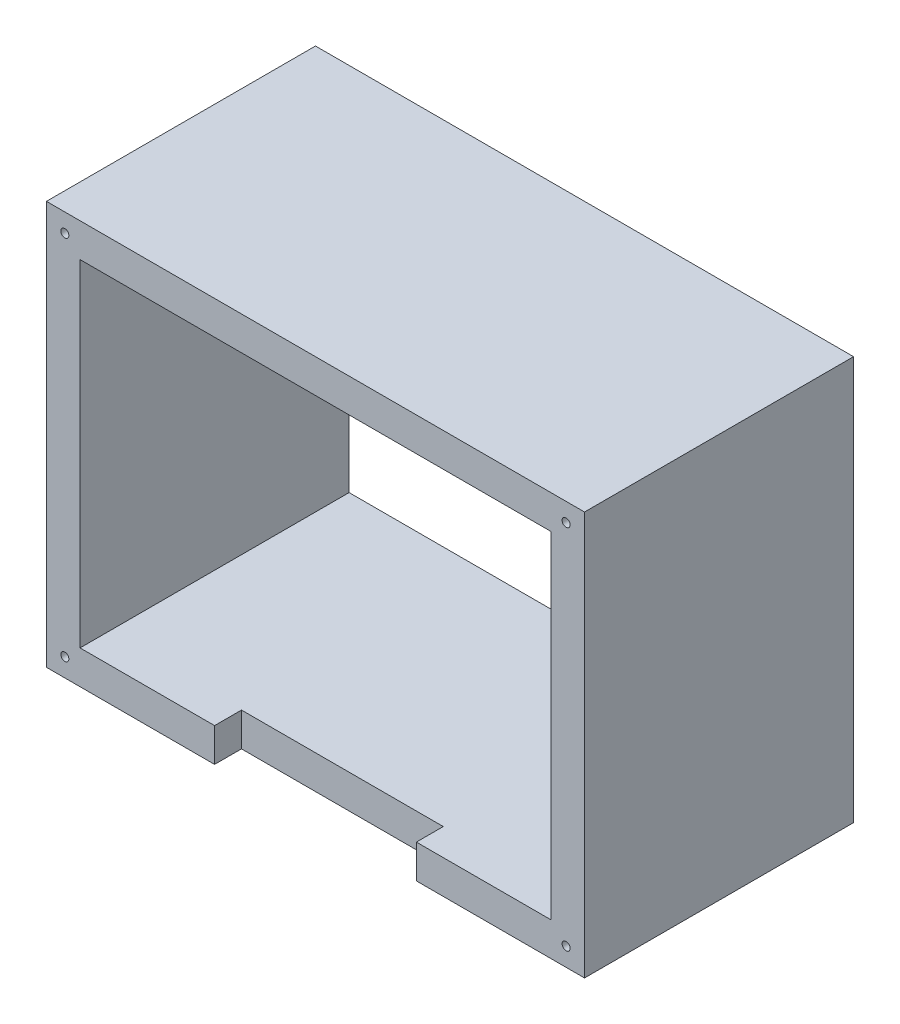
ISO-10303-21;
HEADER;
FILE_DESCRIPTION(('STEP AP214'),'2;1');
FILE_NAME('part.step','',(''),(''),'','','');
FILE_SCHEMA(('AUTOMOTIVE_DESIGN { 1 0 10303 214 1 1 1 1 }'));
ENDSEC;
DATA;
#1=APPLICATION_CONTEXT('core data for automotive mechanical design processes');
#2=APPLICATION_PROTOCOL_DEFINITION('international standard','automotive_design',2000,#1);
#3=PRODUCT_CONTEXT('',#1,'mechanical');
#4=PRODUCT('Part','Part','',(#3));
#5=PRODUCT_RELATED_PRODUCT_CATEGORY('part','',(#4));
#6=PRODUCT_DEFINITION_FORMATION('','',#4);
#7=PRODUCT_DEFINITION_CONTEXT('part definition',#1,'design');
#8=PRODUCT_DEFINITION('design','',#6,#7);
#9=PRODUCT_DEFINITION_SHAPE('','',#8);
#10=(LENGTH_UNIT() NAMED_UNIT(*) SI_UNIT(.MILLI.,.METRE.));
#11=(NAMED_UNIT(*) PLANE_ANGLE_UNIT() SI_UNIT($,.RADIAN.));
#12=(NAMED_UNIT(*) SI_UNIT($,.STERADIAN.) SOLID_ANGLE_UNIT());
#13=UNCERTAINTY_MEASURE_WITH_UNIT(LENGTH_MEASURE(1.E-05),#10,'distance_accuracy_value','');
#14=(GEOMETRIC_REPRESENTATION_CONTEXT(3) GLOBAL_UNCERTAINTY_ASSIGNED_CONTEXT((#13)) GLOBAL_UNIT_ASSIGNED_CONTEXT((#10,
#11,#12)) REPRESENTATION_CONTEXT('',''));
#15=CARTESIAN_POINT('',(0.,0.,0.));
#16=DIRECTION('',(0.,0.,1.));
#17=DIRECTION('',(1.,0.,0.));
#18=AXIS2_PLACEMENT_3D('',#15,#16,#17);
#19=CARTESIAN_POINT('',(-88.8348714569122,57.3807057270259,100.));
#20=DIRECTION('',(1.,0.,0.));
#21=DIRECTION('',(0.,1.,0.));
#22=AXIS2_PLACEMENT_3D('',#19,#20,#21);
#23=PLANE('',#22);
#24=DIRECTION('',(0.,-1.,0.));
#25=VECTOR('',#24,1.);
#26=CARTESIAN_POINT('',(-88.8348714569122,57.3807057270259,0.));
#27=LINE('',#26,#25);
#28=CARTESIAN_POINT('',(-88.8348714569122,57.3807057270259,0.));
#29=VERTEX_POINT('',#28);
#30=CARTESIAN_POINT('',(-88.8348714569122,-92.619294272974,0.));
#31=VERTEX_POINT('',#30);
#32=EDGE_CURVE('E179',#29,#31,#27,.T.);
#33=ORIENTED_EDGE('',*,*,#32,.T.);
#34=DIRECTION('',(0.,0.,-1.));
#35=VECTOR('',#34,1.);
#36=CARTESIAN_POINT('',(-88.8348714569122,-92.619294272974,100.));
#37=LINE('',#36,#35);
#38=CARTESIAN_POINT('',(-88.8348714569122,-92.619294272974,100.));
#39=VERTEX_POINT('',#38);
#40=EDGE_CURVE('E11',#39,#31,#37,.T.);
#41=ORIENTED_EDGE('',*,*,#40,.F.);
#42=DIRECTION('',(0.,-1.,0.));
#43=VECTOR('',#42,1.);
#44=CARTESIAN_POINT('',(-88.8348714569122,57.3807057270259,100.));
#45=LINE('',#44,#43);
#46=CARTESIAN_POINT('',(-88.8348714569122,57.3807057270259,100.));
#47=VERTEX_POINT('',#46);
#48=EDGE_CURVE('E186',#47,#39,#45,.T.);
#49=ORIENTED_EDGE('',*,*,#48,.F.);
#50=DIRECTION('',(0.,0.,-1.));
#51=VECTOR('',#50,1.);
#52=CARTESIAN_POINT('',(-88.8348714569122,57.3807057270259,100.));
#53=LINE('',#52,#51);
#54=EDGE_CURVE('E198',#47,#29,#53,.T.);
#55=ORIENTED_EDGE('',*,*,#54,.T.);
#56=EDGE_LOOP('',(#33,#41,#49,#55));
#57=FACE_BOUND('',#56,.T.);
#58=ADVANCED_FACE('F32',(#57),#23,.F.);
#59=CARTESIAN_POINT('',(-88.8348714569122,-92.619294272974,100.));
#60=DIRECTION('',(0.,1.,0.));
#61=DIRECTION('',(0.,0.,1.));
#62=AXIS2_PLACEMENT_3D('',#59,#60,#61);
#63=PLANE('',#62);
#64=DIRECTION('',(1.,0.,0.));
#65=VECTOR('',#64,1.);
#66=CARTESIAN_POINT('',(-88.8348714569122,-92.619294272974,100.));
#67=LINE('',#66,#65);
#68=CARTESIAN_POINT('',(48.6651285430878,-92.619294272974,100.));
#69=VERTEX_POINT('',#68);
#70=CARTESIAN_POINT('',(111.165128543088,-92.619294272974,100.));
#71=VERTEX_POINT('',#70);
#72=EDGE_CURVE('E189',#69,#71,#67,.T.);
#73=ORIENTED_EDGE('',*,*,#72,.F.);
#74=DIRECTION('',(0.,0.,-1.));
#75=VECTOR('',#74,1.);
#76=CARTESIAN_POINT('',(48.6651285430878,-92.619294272974,100.));
#77=LINE('',#76,#75);
#78=CARTESIAN_POINT('',(48.6651285430878,-92.619294272974,90.));
#79=VERTEX_POINT('',#78);
#80=EDGE_CURVE('E151',#69,#79,#77,.T.);
#81=ORIENTED_EDGE('',*,*,#80,.T.);
#82=DIRECTION('',(-1.,0.,0.));
#83=VECTOR('',#82,1.);
#84=CARTESIAN_POINT('',(-88.8348714569122,-92.619294272974,90.));
#85=LINE('',#84,#83);
#86=CARTESIAN_POINT('',(-26.3348714569122,-92.619294272974,90.));
#87=VERTEX_POINT('',#86);
#88=EDGE_CURVE('E147',#79,#87,#85,.T.);
#89=ORIENTED_EDGE('',*,*,#88,.T.);
#90=DIRECTION('',(0.,0.,1.));
#91=VECTOR('',#90,1.);
#92=CARTESIAN_POINT('',(-26.3348714569122,-92.619294272974,100.));
#93=LINE('',#92,#91);
#94=CARTESIAN_POINT('',(-26.3348714569122,-92.619294272974,100.));
#95=VERTEX_POINT('',#94);
#96=EDGE_CURVE('E128',#87,#95,#93,.T.);
#97=ORIENTED_EDGE('',*,*,#96,.T.);
#98=EDGE_CURVE('E191',#39,#95,#67,.T.);
#99=ORIENTED_EDGE('',*,*,#98,.F.);
#100=ORIENTED_EDGE('',*,*,#40,.T.);
#101=DIRECTION('',(1.,0.,0.));
#102=VECTOR('',#101,1.);
#103=CARTESIAN_POINT('',(-88.8348714569122,-92.619294272974,0.));
#104=LINE('',#103,#102);
#105=CARTESIAN_POINT('',(111.165128543088,-92.619294272974,0.));
#106=VERTEX_POINT('',#105);
#107=EDGE_CURVE('E201',#31,#106,#104,.T.);
#108=ORIENTED_EDGE('',*,*,#107,.T.);
#109=DIRECTION('',(0.,0.,-1.));
#110=VECTOR('',#109,1.);
#111=CARTESIAN_POINT('',(111.165128543088,-92.619294272974,100.));
#112=LINE('',#111,#110);
#113=EDGE_CURVE('E39',#71,#106,#112,.T.);
#114=ORIENTED_EDGE('',*,*,#113,.F.);
#115=EDGE_LOOP('',(#73,#81,#89,#97,#99,#100,#108,#114));
#116=FACE_BOUND('',#115,.T.);
#117=ADVANCED_FACE('F232',(#116),#63,.F.);
#118=CARTESIAN_POINT('',(111.165128543088,57.3807057270259,100.));
#119=DIRECTION('',(-1.,0.,0.));
#120=DIRECTION('',(0.,0.,1.));
#121=AXIS2_PLACEMENT_3D('',#118,#119,#120);
#122=PLANE('',#121);
#123=DIRECTION('',(0.,1.,0.));
#124=VECTOR('',#123,1.);
#125=CARTESIAN_POINT('',(111.165128543088,57.3807057270259,0.));
#126=LINE('',#125,#124);
#127=CARTESIAN_POINT('',(111.165128543088,57.3807057270259,0.));
#128=VERTEX_POINT('',#127);
#129=EDGE_CURVE('E203',#106,#128,#126,.T.);
#130=ORIENTED_EDGE('',*,*,#129,.T.);
#131=DIRECTION('',(0.,0.,-1.));
#132=VECTOR('',#131,1.);
#133=CARTESIAN_POINT('',(111.165128543088,57.3807057270259,100.));
#134=LINE('',#133,#132);
#135=CARTESIAN_POINT('',(111.165128543088,57.3807057270259,100.));
#136=VERTEX_POINT('',#135);
#137=EDGE_CURVE('E208',#136,#128,#134,.T.);
#138=ORIENTED_EDGE('',*,*,#137,.F.);
#139=DIRECTION('',(0.,1.,0.));
#140=VECTOR('',#139,1.);
#141=CARTESIAN_POINT('',(111.165128543088,57.3807057270259,100.));
#142=LINE('',#141,#140);
#143=EDGE_CURVE('E194',#71,#136,#142,.T.);
#144=ORIENTED_EDGE('',*,*,#143,.F.);
#145=ORIENTED_EDGE('',*,*,#113,.T.);
#146=EDGE_LOOP('',(#130,#138,#144,#145));
#147=FACE_BOUND('',#146,.T.);
#148=ADVANCED_FACE('F215',(#147),#122,.F.);
#149=CARTESIAN_POINT('',(-88.8348714569122,57.3807057270259,100.));
#150=DIRECTION('',(0.,-1.,0.));
#151=DIRECTION('',(0.,0.,-1.));
#152=AXIS2_PLACEMENT_3D('',#149,#150,#151);
#153=PLANE('',#152);
#154=DIRECTION('',(-1.,0.,0.));
#155=VECTOR('',#154,1.);
#156=CARTESIAN_POINT('',(-88.8348714569122,57.3807057270259,0.));
#157=LINE('',#156,#155);
#158=EDGE_CURVE('E190',#128,#29,#157,.T.);
#159=ORIENTED_EDGE('',*,*,#158,.T.);
#160=ORIENTED_EDGE('',*,*,#54,.F.);
#161=DIRECTION('',(-1.,0.,0.));
#162=VECTOR('',#161,1.);
#163=CARTESIAN_POINT('',(-88.8348714569122,57.3807057270259,100.));
#164=LINE('',#163,#162);
#165=EDGE_CURVE('E196',#136,#47,#164,.T.);
#166=ORIENTED_EDGE('',*,*,#165,.F.);
#167=ORIENTED_EDGE('',*,*,#137,.T.);
#168=EDGE_LOOP('',(#159,#160,#166,#167));
#169=FACE_BOUND('',#168,.T.);
#170=ADVANCED_FACE('F225',(#169),#153,.F.);
#171=CARTESIAN_POINT('',(0.,0.,100.));
#172=DIRECTION('',(0.,0.,1.));
#173=DIRECTION('',(1.,0.,0.));
#174=AXIS2_PLACEMENT_3D('',#171,#172,#173);
#175=PLANE('',#174);
#176=CARTESIAN_POINT('',(-81.9917257064046,-85.7761485224664,100.));
#177=DIRECTION('',(0.,0.,1.));
#178=DIRECTION('',(1.,0.,0.));
#179=AXIS2_PLACEMENT_3D('',#176,#177,#178);
#180=CIRCLE('',#179,1.5);
#181=CARTESIAN_POINT('',(-80.4917257064046,-85.7761485224664,100.));
#182=VERTEX_POINT('',#181);
#183=EDGE_CURVE('E334',#182,#182,#180,.T.);
#184=ORIENTED_EDGE('',*,*,#183,.F.);
#185=EDGE_LOOP('',(#184));
#186=FACE_BOUND('',#185,.T.);
#187=CARTESIAN_POINT('',(104.32198279258,50.5375599765183,100.));
#188=DIRECTION('',(0.,0.,1.));
#189=DIRECTION('',(1.,0.,0.));
#190=AXIS2_PLACEMENT_3D('',#187,#188,#189);
#191=CIRCLE('',#190,1.5);
#192=CARTESIAN_POINT('',(105.82198279258,50.5375599765183,100.));
#193=VERTEX_POINT('',#192);
#194=EDGE_CURVE('E321',#193,#193,#191,.T.);
#195=ORIENTED_EDGE('',*,*,#194,.F.);
#196=EDGE_LOOP('',(#195));
#197=FACE_BOUND('',#196,.T.);
#198=CARTESIAN_POINT('',(104.32198279258,-85.7761485224664,100.));
#199=DIRECTION('',(0.,0.,1.));
#200=DIRECTION('',(1.,0.,0.));
#201=AXIS2_PLACEMENT_3D('',#198,#199,#200);
#202=CIRCLE('',#201,1.5);
#203=CARTESIAN_POINT('',(105.82198279258,-85.7761485224664,100.));
#204=VERTEX_POINT('',#203);
#205=EDGE_CURVE('E322',#204,#204,#202,.T.);
#206=ORIENTED_EDGE('',*,*,#205,.F.);
#207=EDGE_LOOP('',(#206));
#208=FACE_BOUND('',#207,.T.);
#209=CARTESIAN_POINT('',(-81.9917257064046,50.5375599765183,100.));
#210=DIRECTION('',(0.,0.,1.));
#211=DIRECTION('',(1.,0.,0.));
#212=AXIS2_PLACEMENT_3D('',#209,#210,#211);
#213=CIRCLE('',#212,1.5);
#214=CARTESIAN_POINT('',(-80.4917257064046,50.5375599765183,100.));
#215=VERTEX_POINT('',#214);
#216=EDGE_CURVE('E333',#215,#215,#213,.T.);
#217=ORIENTED_EDGE('',*,*,#216,.F.);
#218=EDGE_LOOP('',(#217));
#219=FACE_BOUND('',#218,.T.);
#220=DIRECTION('',(0.,1.,0.));
#221=VECTOR('',#220,1.);
#222=CARTESIAN_POINT('',(48.6651285430878,-95.1192942729741,100.));
#223=LINE('',#222,#221);
#224=CARTESIAN_POINT('',(48.6651285430878,-80.1192942729741,100.));
#225=VERTEX_POINT('',#224);
#226=EDGE_CURVE('E145',#69,#225,#223,.T.);
#227=ORIENTED_EDGE('',*,*,#226,.F.);
#228=ORIENTED_EDGE('',*,*,#72,.T.);
#229=ORIENTED_EDGE('',*,*,#143,.T.);
#230=ORIENTED_EDGE('',*,*,#165,.T.);
#231=ORIENTED_EDGE('',*,*,#48,.T.);
#232=ORIENTED_EDGE('',*,*,#98,.T.);
#233=DIRECTION('',(0.,1.,0.));
#234=VECTOR('',#233,1.);
#235=CARTESIAN_POINT('',(-26.3348714569122,-95.1192942729741,100.));
#236=LINE('',#235,#234);
#237=CARTESIAN_POINT('',(-26.3348714569122,-80.1192942729741,100.));
#238=VERTEX_POINT('',#237);
#239=EDGE_CURVE('E131',#95,#238,#236,.T.);
#240=ORIENTED_EDGE('',*,*,#239,.T.);
#241=DIRECTION('',(-1.,0.,0.));
#242=VECTOR('',#241,1.);
#243=CARTESIAN_POINT('',(98.6651285430878,-80.1192942729741,100.));
#244=LINE('',#243,#242);
#245=CARTESIAN_POINT('',(-76.3348714569122,-80.1192942729741,100.));
#246=VERTEX_POINT('',#245);
#247=EDGE_CURVE('E54',#238,#246,#244,.T.);
#248=ORIENTED_EDGE('',*,*,#247,.T.);
#249=DIRECTION('',(0.,1.,0.));
#250=VECTOR('',#249,1.);
#251=CARTESIAN_POINT('',(-76.3348714569122,44.8807057270259,100.));
#252=LINE('',#251,#250);
#253=CARTESIAN_POINT('',(-76.3348714569122,44.8807057270259,100.));
#254=VERTEX_POINT('',#253);
#255=EDGE_CURVE('E162',#246,#254,#252,.T.);
#256=ORIENTED_EDGE('',*,*,#255,.T.);
#257=DIRECTION('',(1.,0.,0.));
#258=VECTOR('',#257,1.);
#259=CARTESIAN_POINT('',(98.6651285430878,44.8807057270259,100.));
#260=LINE('',#259,#258);
#261=CARTESIAN_POINT('',(98.6651285430878,44.8807057270259,100.));
#262=VERTEX_POINT('',#261);
#263=EDGE_CURVE('E164',#254,#262,#260,.T.);
#264=ORIENTED_EDGE('',*,*,#263,.T.);
#265=DIRECTION('',(0.,-1.,0.));
#266=VECTOR('',#265,1.);
#267=CARTESIAN_POINT('',(98.6651285430878,44.8807057270259,100.));
#268=LINE('',#267,#266);
#269=CARTESIAN_POINT('',(98.6651285430878,-80.1192942729741,100.));
#270=VERTEX_POINT('',#269);
#271=EDGE_CURVE('E155',#262,#270,#268,.T.);
#272=ORIENTED_EDGE('',*,*,#271,.T.);
#273=EDGE_CURVE('E159',#270,#225,#244,.T.);
#274=ORIENTED_EDGE('',*,*,#273,.T.);
#275=EDGE_LOOP('',(#227,#228,#229,#230,#231,#232,#240,#248,#256,#264,#272,#274));
#276=FACE_BOUND('',#275,.T.);
#277=ADVANCED_FACE('F231',(#186,#197,#208,#219,#276),#175,.T.);
#278=CARTESIAN_POINT('',(0.,0.,0.));
#279=DIRECTION('',(0.,0.,1.));
#280=DIRECTION('',(1.,0.,0.));
#281=AXIS2_PLACEMENT_3D('',#278,#279,#280);
#282=PLANE('',#281);
#283=DIRECTION('',(-1.,0.,0.));
#284=VECTOR('',#283,1.);
#285=CARTESIAN_POINT('',(98.6651285430878,-80.1192942729741,0.));
#286=LINE('',#285,#284);
#287=CARTESIAN_POINT('',(98.6651285430878,-80.1192942729741,0.));
#288=VERTEX_POINT('',#287);
#289=CARTESIAN_POINT('',(-76.3348714569122,-80.1192942729741,0.));
#290=VERTEX_POINT('',#289);
#291=EDGE_CURVE('E169',#288,#290,#286,.T.);
#292=ORIENTED_EDGE('',*,*,#291,.F.);
#293=DIRECTION('',(0.,-1.,0.));
#294=VECTOR('',#293,1.);
#295=CARTESIAN_POINT('',(98.6651285430878,44.8807057270259,0.));
#296=LINE('',#295,#294);
#297=CARTESIAN_POINT('',(98.6651285430878,44.8807057270259,0.));
#298=VERTEX_POINT('',#297);
#299=EDGE_CURVE('E154',#298,#288,#296,.T.);
#300=ORIENTED_EDGE('',*,*,#299,.F.);
#301=DIRECTION('',(1.,0.,0.));
#302=VECTOR('',#301,1.);
#303=CARTESIAN_POINT('',(98.6651285430878,44.8807057270259,0.));
#304=LINE('',#303,#302);
#305=CARTESIAN_POINT('',(-76.3348714569122,44.8807057270259,0.));
#306=VERTEX_POINT('',#305);
#307=EDGE_CURVE('E158',#306,#298,#304,.T.);
#308=ORIENTED_EDGE('',*,*,#307,.F.);
#309=DIRECTION('',(0.,1.,0.));
#310=VECTOR('',#309,1.);
#311=CARTESIAN_POINT('',(-76.3348714569122,44.8807057270259,0.));
#312=LINE('',#311,#310);
#313=EDGE_CURVE('E172',#290,#306,#312,.T.);
#314=ORIENTED_EDGE('',*,*,#313,.F.);
#315=EDGE_LOOP('',(#292,#300,#308,#314));
#316=FACE_BOUND('',#315,.T.);
#317=ORIENTED_EDGE('',*,*,#32,.F.);
#318=ORIENTED_EDGE('',*,*,#158,.F.);
#319=ORIENTED_EDGE('',*,*,#129,.F.);
#320=ORIENTED_EDGE('',*,*,#107,.F.);
#321=EDGE_LOOP('',(#317,#318,#319,#320));
#322=FACE_BOUND('',#321,.T.);
#323=ADVANCED_FACE('F222',(#316,#322),#282,.F.);
#324=CARTESIAN_POINT('',(98.6651285430878,44.8807057270259,100.));
#325=DIRECTION('',(1.,0.,0.));
#326=DIRECTION('',(0.,1.,0.));
#327=AXIS2_PLACEMENT_3D('',#324,#325,#326);
#328=PLANE('',#327);
#329=ORIENTED_EDGE('',*,*,#299,.T.);
#330=DIRECTION('',(0.,0.,-1.));
#331=VECTOR('',#330,1.);
#332=CARTESIAN_POINT('',(98.6651285430878,-80.1192942729741,100.));
#333=LINE('',#332,#331);
#334=EDGE_CURVE('E167',#270,#288,#333,.T.);
#335=ORIENTED_EDGE('',*,*,#334,.F.);
#336=ORIENTED_EDGE('',*,*,#271,.F.);
#337=DIRECTION('',(0.,0.,-1.));
#338=VECTOR('',#337,1.);
#339=CARTESIAN_POINT('',(98.6651285430878,44.8807057270259,100.));
#340=LINE('',#339,#338);
#341=EDGE_CURVE('E177',#262,#298,#340,.T.);
#342=ORIENTED_EDGE('',*,*,#341,.T.);
#343=EDGE_LOOP('',(#329,#335,#336,#342));
#344=FACE_BOUND('',#343,.T.);
#345=ADVANCED_FACE('F239',(#344),#328,.F.);
#346=CARTESIAN_POINT('',(98.6651285430878,44.8807057270259,100.));
#347=DIRECTION('',(0.,1.,0.));
#348=DIRECTION('',(0.,0.,1.));
#349=AXIS2_PLACEMENT_3D('',#346,#347,#348);
#350=PLANE('',#349);
#351=ORIENTED_EDGE('',*,*,#307,.T.);
#352=ORIENTED_EDGE('',*,*,#341,.F.);
#353=ORIENTED_EDGE('',*,*,#263,.F.);
#354=DIRECTION('',(0.,0.,-1.));
#355=VECTOR('',#354,1.);
#356=CARTESIAN_POINT('',(-76.3348714569122,44.8807057270259,100.));
#357=LINE('',#356,#355);
#358=EDGE_CURVE('E180',#254,#306,#357,.T.);
#359=ORIENTED_EDGE('',*,*,#358,.T.);
#360=EDGE_LOOP('',(#351,#352,#353,#359));
#361=FACE_BOUND('',#360,.T.);
#362=ADVANCED_FACE('F248',(#361),#350,.F.);
#363=CARTESIAN_POINT('',(-76.3348714569122,44.8807057270259,100.));
#364=DIRECTION('',(-1.,0.,0.));
#365=DIRECTION('',(0.,0.,1.));
#366=AXIS2_PLACEMENT_3D('',#363,#364,#365);
#367=PLANE('',#366);
#368=ORIENTED_EDGE('',*,*,#313,.T.);
#369=ORIENTED_EDGE('',*,*,#358,.F.);
#370=ORIENTED_EDGE('',*,*,#255,.F.);
#371=DIRECTION('',(0.,0.,-1.));
#372=VECTOR('',#371,1.);
#373=CARTESIAN_POINT('',(-76.3348714569122,-80.1192942729741,100.));
#374=LINE('',#373,#372);
#375=EDGE_CURVE('E182',#246,#290,#374,.T.);
#376=ORIENTED_EDGE('',*,*,#375,.T.);
#377=EDGE_LOOP('',(#368,#369,#370,#376));
#378=FACE_BOUND('',#377,.T.);
#379=ADVANCED_FACE('F246',(#378),#367,.F.);
#380=CARTESIAN_POINT('',(98.6651285430878,-80.1192942729741,100.));
#381=DIRECTION('',(0.,-1.,0.));
#382=DIRECTION('',(0.,0.,-1.));
#383=AXIS2_PLACEMENT_3D('',#380,#381,#382);
#384=PLANE('',#383);
#385=DIRECTION('',(-1.,0.,0.));
#386=VECTOR('',#385,1.);
#387=CARTESIAN_POINT('',(48.6651285430878,-80.1192942729741,90.));
#388=LINE('',#387,#386);
#389=CARTESIAN_POINT('',(48.6651285430878,-80.1192942729741,90.));
#390=VERTEX_POINT('',#389);
#391=CARTESIAN_POINT('',(-26.3348714569122,-80.1192942729741,90.));
#392=VERTEX_POINT('',#391);
#393=EDGE_CURVE('E135',#390,#392,#388,.T.);
#394=ORIENTED_EDGE('',*,*,#393,.F.);
#395=DIRECTION('',(0.,0.,-1.));
#396=VECTOR('',#395,1.);
#397=CARTESIAN_POINT('',(48.6651285430878,-80.1192942729741,90.));
#398=LINE('',#397,#396);
#399=EDGE_CURVE('E46',#225,#390,#398,.T.);
#400=ORIENTED_EDGE('',*,*,#399,.F.);
#401=ORIENTED_EDGE('',*,*,#273,.F.);
#402=ORIENTED_EDGE('',*,*,#334,.T.);
#403=ORIENTED_EDGE('',*,*,#291,.T.);
#404=ORIENTED_EDGE('',*,*,#375,.F.);
#405=ORIENTED_EDGE('',*,*,#247,.F.);
#406=DIRECTION('',(0.,0.,1.));
#407=VECTOR('',#406,1.);
#408=CARTESIAN_POINT('',(-26.3348714569122,-80.1192942729741,90.));
#409=LINE('',#408,#407);
#410=EDGE_CURVE('E126',#392,#238,#409,.T.);
#411=ORIENTED_EDGE('',*,*,#410,.F.);
#412=EDGE_LOOP('',(#394,#400,#401,#402,#403,#404,#405,#411));
#413=FACE_BOUND('',#412,.T.);
#414=ADVANCED_FACE('F139',(#413),#384,.F.);
#415=CARTESIAN_POINT('',(48.6651285430878,-95.1192942729741,90.));
#416=DIRECTION('',(1.,0.,0.));
#417=DIRECTION('',(0.,0.,-1.));
#418=AXIS2_PLACEMENT_3D('',#415,#416,#417);
#419=PLANE('',#418);
#420=ORIENTED_EDGE('',*,*,#226,.T.);
#421=ORIENTED_EDGE('',*,*,#399,.T.);
#422=DIRECTION('',(0.,1.,0.));
#423=VECTOR('',#422,1.);
#424=CARTESIAN_POINT('',(48.6651285430878,-95.1192942729741,90.));
#425=LINE('',#424,#423);
#426=EDGE_CURVE('E132',#79,#390,#425,.T.);
#427=ORIENTED_EDGE('',*,*,#426,.F.);
#428=ORIENTED_EDGE('',*,*,#80,.F.);
#429=EDGE_LOOP('',(#420,#421,#427,#428));
#430=FACE_BOUND('',#429,.T.);
#431=ADVANCED_FACE('F233',(#430),#419,.F.);
#432=CARTESIAN_POINT('',(-26.3348714569122,-95.1192942729741,90.));
#433=DIRECTION('',(-1.,0.,0.));
#434=DIRECTION('',(0.,0.,1.));
#435=AXIS2_PLACEMENT_3D('',#432,#433,#434);
#436=PLANE('',#435);
#437=DIRECTION('',(0.,1.,0.));
#438=VECTOR('',#437,1.);
#439=CARTESIAN_POINT('',(-26.3348714569122,-95.1192942729741,90.));
#440=LINE('',#439,#438);
#441=EDGE_CURVE('E122',#87,#392,#440,.T.);
#442=ORIENTED_EDGE('',*,*,#441,.T.);
#443=ORIENTED_EDGE('',*,*,#410,.T.);
#444=ORIENTED_EDGE('',*,*,#239,.F.);
#445=ORIENTED_EDGE('',*,*,#96,.F.);
#446=EDGE_LOOP('',(#442,#443,#444,#445));
#447=FACE_BOUND('',#446,.T.);
#448=ADVANCED_FACE('F124',(#447),#436,.F.);
#449=CARTESIAN_POINT('',(48.6651285430878,-95.1192942729741,90.));
#450=DIRECTION('',(0.,0.,-1.));
#451=DIRECTION('',(-1.,0.,0.));
#452=AXIS2_PLACEMENT_3D('',#449,#450,#451);
#453=PLANE('',#452);
#454=ORIENTED_EDGE('',*,*,#426,.T.);
#455=ORIENTED_EDGE('',*,*,#393,.T.);
#456=ORIENTED_EDGE('',*,*,#441,.F.);
#457=ORIENTED_EDGE('',*,*,#88,.F.);
#458=EDGE_LOOP('',(#454,#455,#456,#457));
#459=FACE_BOUND('',#458,.T.);
#460=ADVANCED_FACE('F136',(#459),#453,.F.);
#461=CARTESIAN_POINT('',(-81.9917257064046,50.5375599765183,80.));
#462=DIRECTION('',(0.,0.,1.));
#463=DIRECTION('',(1.,0.,0.));
#464=AXIS2_PLACEMENT_3D('',#461,#462,#463);
#465=CYLINDRICAL_SURFACE('',#464,1.5);
#466=CARTESIAN_POINT('',(-81.9917257064046,50.5375599765183,80.));
#467=DIRECTION('',(0.,0.,1.));
#468=DIRECTION('',(1.,0.,0.));
#469=AXIS2_PLACEMENT_3D('',#466,#467,#468);
#470=CIRCLE('',#469,1.5);
#471=CARTESIAN_POINT('',(-80.4917257064046,50.5375599765183,80.));
#472=VERTEX_POINT('',#471);
#473=EDGE_CURVE('E235',#472,#472,#470,.T.);
#474=ORIENTED_EDGE('',*,*,#473,.F.);
#475=EDGE_LOOP('',(#474));
#476=FACE_BOUND('',#475,.T.);
#477=ORIENTED_EDGE('',*,*,#216,.T.);
#478=EDGE_LOOP('',(#477));
#479=FACE_BOUND('',#478,.T.);
#480=ADVANCED_FACE('F284',(#476,#479),#465,.F.);
#481=CARTESIAN_POINT('',(-81.9917257064046,50.5375599765183,80.));
#482=DIRECTION('',(0.,0.,1.));
#483=DIRECTION('',(1.,0.,0.));
#484=AXIS2_PLACEMENT_3D('',#481,#482,#483);
#485=PLANE('',#484);
#486=ORIENTED_EDGE('',*,*,#473,.T.);
#487=EDGE_LOOP('',(#486));
#488=FACE_BOUND('',#487,.T.);
#489=ADVANCED_FACE('F288',(#488),#485,.T.);
#490=CARTESIAN_POINT('',(104.32198279258,-85.7761485224664,80.));
#491=DIRECTION('',(0.,0.,1.));
#492=DIRECTION('',(1.,0.,0.));
#493=AXIS2_PLACEMENT_3D('',#490,#491,#492);
#494=CYLINDRICAL_SURFACE('',#493,1.5);
#495=CARTESIAN_POINT('',(104.32198279258,-85.7761485224664,80.));
#496=DIRECTION('',(0.,0.,1.));
#497=DIRECTION('',(1.,0.,0.));
#498=AXIS2_PLACEMENT_3D('',#495,#496,#497);
#499=CIRCLE('',#498,1.5);
#500=CARTESIAN_POINT('',(105.82198279258,-85.7761485224664,80.));
#501=VERTEX_POINT('',#500);
#502=EDGE_CURVE('E320',#501,#501,#499,.T.);
#503=ORIENTED_EDGE('',*,*,#502,.F.);
#504=EDGE_LOOP('',(#503));
#505=FACE_BOUND('',#504,.T.);
#506=ORIENTED_EDGE('',*,*,#205,.T.);
#507=EDGE_LOOP('',(#506));
#508=FACE_BOUND('',#507,.T.);
#509=ADVANCED_FACE('F292',(#505,#508),#494,.F.);
#510=CARTESIAN_POINT('',(104.32198279258,-85.7761485224664,80.));
#511=DIRECTION('',(0.,0.,1.));
#512=DIRECTION('',(1.,0.,0.));
#513=AXIS2_PLACEMENT_3D('',#510,#511,#512);
#514=PLANE('',#513);
#515=ORIENTED_EDGE('',*,*,#502,.T.);
#516=EDGE_LOOP('',(#515));
#517=FACE_BOUND('',#516,.T.);
#518=ADVANCED_FACE('F298',(#517),#514,.T.);
#519=CARTESIAN_POINT('',(104.32198279258,50.5375599765183,80.));
#520=DIRECTION('',(0.,0.,1.));
#521=DIRECTION('',(1.,0.,0.));
#522=AXIS2_PLACEMENT_3D('',#519,#520,#521);
#523=CYLINDRICAL_SURFACE('',#522,1.5);
#524=CARTESIAN_POINT('',(104.32198279258,50.5375599765183,80.));
#525=DIRECTION('',(0.,0.,1.));
#526=DIRECTION('',(1.,0.,0.));
#527=AXIS2_PLACEMENT_3D('',#524,#525,#526);
#528=CIRCLE('',#527,1.5);
#529=CARTESIAN_POINT('',(105.82198279258,50.5375599765183,80.));
#530=VERTEX_POINT('',#529);
#531=EDGE_CURVE('E325',#530,#530,#528,.T.);
#532=ORIENTED_EDGE('',*,*,#531,.F.);
#533=EDGE_LOOP('',(#532));
#534=FACE_BOUND('',#533,.T.);
#535=ORIENTED_EDGE('',*,*,#194,.T.);
#536=EDGE_LOOP('',(#535));
#537=FACE_BOUND('',#536,.T.);
#538=ADVANCED_FACE('F294',(#534,#537),#523,.F.);
#539=CARTESIAN_POINT('',(104.32198279258,50.5375599765183,80.));
#540=DIRECTION('',(0.,0.,1.));
#541=DIRECTION('',(1.,0.,0.));
#542=AXIS2_PLACEMENT_3D('',#539,#540,#541);
#543=PLANE('',#542);
#544=ORIENTED_EDGE('',*,*,#531,.T.);
#545=EDGE_LOOP('',(#544));
#546=FACE_BOUND('',#545,.T.);
#547=ADVANCED_FACE('F297',(#546),#543,.T.);
#548=CARTESIAN_POINT('',(-81.9917257064046,-85.7761485224664,80.));
#549=DIRECTION('',(0.,0.,1.));
#550=DIRECTION('',(1.,0.,0.));
#551=AXIS2_PLACEMENT_3D('',#548,#549,#550);
#552=CYLINDRICAL_SURFACE('',#551,1.5);
#553=CARTESIAN_POINT('',(-81.9917257064046,-85.7761485224664,80.));
#554=DIRECTION('',(0.,0.,1.));
#555=DIRECTION('',(1.,0.,0.));
#556=AXIS2_PLACEMENT_3D('',#553,#554,#555);
#557=CIRCLE('',#556,1.5);
#558=CARTESIAN_POINT('',(-80.4917257064046,-85.7761485224664,80.));
#559=VERTEX_POINT('',#558);
#560=EDGE_CURVE('E330',#559,#559,#557,.T.);
#561=ORIENTED_EDGE('',*,*,#560,.F.);
#562=EDGE_LOOP('',(#561));
#563=FACE_BOUND('',#562,.T.);
#564=ORIENTED_EDGE('',*,*,#183,.T.);
#565=EDGE_LOOP('',(#564));
#566=FACE_BOUND('',#565,.T.);
#567=ADVANCED_FACE('F302',(#563,#566),#552,.F.);
#568=CARTESIAN_POINT('',(-81.9917257064046,-85.7761485224664,80.));
#569=DIRECTION('',(0.,0.,1.));
#570=DIRECTION('',(1.,0.,0.));
#571=AXIS2_PLACEMENT_3D('',#568,#569,#570);
#572=PLANE('',#571);
#573=ORIENTED_EDGE('',*,*,#560,.T.);
#574=EDGE_LOOP('',(#573));
#575=FACE_BOUND('',#574,.T.);
#576=ADVANCED_FACE('F306',(#575),#572,.T.);
#577=CLOSED_SHELL('',(#58,#117,#148,#170,#277,#323,#345,#362,#379,#414,#431,#448,#460,#480,#489,
#509,#518,#538,#547,#567,#576));
#578=MANIFOLD_SOLID_BREP('B2',#577);
#579=ADVANCED_BREP_SHAPE_REPRESENTATION('',(#18,#578),#14);
#580=SHAPE_DEFINITION_REPRESENTATION(#9,#579);
ENDSEC;
END-ISO-10303-21;
